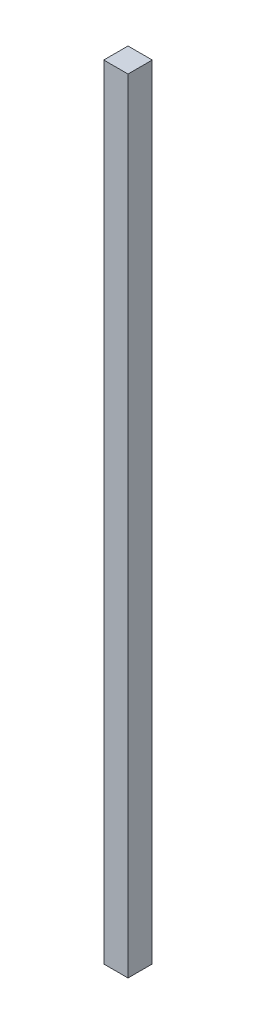
ISO-10303-21;
HEADER;
FILE_DESCRIPTION(('STEP AP214'),'2;1');
FILE_NAME('part.step','',(''),(''),'','','');
FILE_SCHEMA(('AUTOMOTIVE_DESIGN { 1 0 10303 214 1 1 1 1 }'));
ENDSEC;
DATA;
#1=APPLICATION_CONTEXT('core data for automotive mechanical design processes');
#2=APPLICATION_PROTOCOL_DEFINITION('international standard','automotive_design',2000,#1);
#3=PRODUCT_CONTEXT('',#1,'mechanical');
#4=PRODUCT('Part','Part','',(#3));
#5=PRODUCT_RELATED_PRODUCT_CATEGORY('part','',(#4));
#6=PRODUCT_DEFINITION_FORMATION('','',#4);
#7=PRODUCT_DEFINITION_CONTEXT('part definition',#1,'design');
#8=PRODUCT_DEFINITION('design','',#6,#7);
#9=PRODUCT_DEFINITION_SHAPE('','',#8);
#10=(LENGTH_UNIT() NAMED_UNIT(*) SI_UNIT(.MILLI.,.METRE.));
#11=(NAMED_UNIT(*) PLANE_ANGLE_UNIT() SI_UNIT($,.RADIAN.));
#12=(NAMED_UNIT(*) SI_UNIT($,.STERADIAN.) SOLID_ANGLE_UNIT());
#13=UNCERTAINTY_MEASURE_WITH_UNIT(LENGTH_MEASURE(1.E-05),#10,'distance_accuracy_value','');
#14=(GEOMETRIC_REPRESENTATION_CONTEXT(3) GLOBAL_UNCERTAINTY_ASSIGNED_CONTEXT((#13)) GLOBAL_UNIT_ASSIGNED_CONTEXT((#10,
#11,#12)) REPRESENTATION_CONTEXT('',''));
#15=CARTESIAN_POINT('',(0.,0.,0.));
#16=DIRECTION('',(0.,0.,1.));
#17=DIRECTION('',(1.,0.,0.));
#18=AXIS2_PLACEMENT_3D('',#15,#16,#17);
#19=CARTESIAN_POINT('',(44.4500000000009,-1435.10000000001,1173.48));
#20=DIRECTION('',(-1.,0.,0.));
#21=DIRECTION('',(0.,0.,1.));
#22=AXIS2_PLACEMENT_3D('',#19,#20,#21);
#23=PLANE('',#22);
#24=DIRECTION('',(0.,1.,0.));
#25=VECTOR('',#24,1.);
#26=CARTESIAN_POINT('',(44.4500000000009,-1435.10000000001,1084.58));
#27=LINE('',#26,#25);
#28=CARTESIAN_POINT('',(44.4500000000009,-1435.10000000001,1084.58));
#29=VERTEX_POINT('',#28);
#30=CARTESIAN_POINT('',(44.4500000000009,1435.09999999999,1084.58));
#31=VERTEX_POINT('',#30);
#32=EDGE_CURVE('E107',#29,#31,#27,.T.);
#33=ORIENTED_EDGE('',*,*,#32,.T.);
#34=DIRECTION('',(0.,0.,-1.));
#35=VECTOR('',#34,1.);
#36=CARTESIAN_POINT('',(44.4500000000009,1435.09999999999,1173.48));
#37=LINE('',#36,#35);
#38=CARTESIAN_POINT('',(44.4500000000009,1435.09999999999,1173.48));
#39=VERTEX_POINT('',#38);
#40=EDGE_CURVE('E11',#39,#31,#37,.T.);
#41=ORIENTED_EDGE('',*,*,#40,.F.);
#42=DIRECTION('',(0.,1.,0.));
#43=VECTOR('',#42,1.);
#44=CARTESIAN_POINT('',(44.4500000000009,-1435.10000000001,1173.48));
#45=LINE('',#44,#43);
#46=CARTESIAN_POINT('',(44.4500000000009,-1435.10000000001,1173.48));
#47=VERTEX_POINT('',#46);
#48=EDGE_CURVE('E91',#47,#39,#45,.T.);
#49=ORIENTED_EDGE('',*,*,#48,.F.);
#50=DIRECTION('',(0.,0.,-1.));
#51=VECTOR('',#50,1.);
#52=CARTESIAN_POINT('',(44.4500000000009,-1435.10000000001,1173.48));
#53=LINE('',#52,#51);
#54=EDGE_CURVE('E103',#47,#29,#53,.T.);
#55=ORIENTED_EDGE('',*,*,#54,.T.);
#56=EDGE_LOOP('',(#33,#41,#49,#55));
#57=FACE_BOUND('',#56,.T.);
#58=ADVANCED_FACE('F39',(#57),#23,.F.);
#59=CARTESIAN_POINT('',(-44.449999999999,1435.09999999999,1173.48));
#60=DIRECTION('',(0.,-1.,0.));
#61=DIRECTION('',(0.,0.,-1.));
#62=AXIS2_PLACEMENT_3D('',#59,#60,#61);
#63=PLANE('',#62);
#64=DIRECTION('',(-1.,0.,0.));
#65=VECTOR('',#64,1.);
#66=CARTESIAN_POINT('',(-44.449999999999,1435.09999999999,1084.58));
#67=LINE('',#66,#65);
#68=CARTESIAN_POINT('',(-44.449999999999,1435.09999999999,1084.58));
#69=VERTEX_POINT('',#68);
#70=EDGE_CURVE('E96',#31,#69,#67,.T.);
#71=ORIENTED_EDGE('',*,*,#70,.T.);
#72=DIRECTION('',(0.,0.,-1.));
#73=VECTOR('',#72,1.);
#74=CARTESIAN_POINT('',(-44.449999999999,1435.09999999999,1173.48));
#75=LINE('',#74,#73);
#76=CARTESIAN_POINT('',(-44.449999999999,1435.09999999999,1173.48));
#77=VERTEX_POINT('',#76);
#78=EDGE_CURVE('E48',#77,#69,#75,.T.);
#79=ORIENTED_EDGE('',*,*,#78,.F.);
#80=DIRECTION('',(-1.,0.,0.));
#81=VECTOR('',#80,1.);
#82=CARTESIAN_POINT('',(-44.449999999999,1435.09999999999,1173.48));
#83=LINE('',#82,#81);
#84=EDGE_CURVE('E86',#39,#77,#83,.T.);
#85=ORIENTED_EDGE('',*,*,#84,.F.);
#86=ORIENTED_EDGE('',*,*,#40,.T.);
#87=EDGE_LOOP('',(#71,#79,#85,#86));
#88=FACE_BOUND('',#87,.T.);
#89=ADVANCED_FACE('F95',(#88),#63,.F.);
#90=CARTESIAN_POINT('',(-44.449999999999,-1435.10000000001,1173.48));
#91=DIRECTION('',(1.,0.,0.));
#92=DIRECTION('',(0.,0.,-1.));
#93=AXIS2_PLACEMENT_3D('',#90,#91,#92);
#94=PLANE('',#93);
#95=DIRECTION('',(0.,-1.,0.));
#96=VECTOR('',#95,1.);
#97=CARTESIAN_POINT('',(-44.449999999999,-1435.10000000001,1084.58));
#98=LINE('',#97,#96);
#99=CARTESIAN_POINT('',(-44.449999999999,-1435.10000000001,1084.58));
#100=VERTEX_POINT('',#99);
#101=EDGE_CURVE('E73',#69,#100,#98,.T.);
#102=ORIENTED_EDGE('',*,*,#101,.T.);
#103=DIRECTION('',(0.,0.,-1.));
#104=VECTOR('',#103,1.);
#105=CARTESIAN_POINT('',(-44.449999999999,-1435.10000000001,1173.48));
#106=LINE('',#105,#104);
#107=CARTESIAN_POINT('',(-44.449999999999,-1435.10000000001,1173.48));
#108=VERTEX_POINT('',#107);
#109=EDGE_CURVE('E98',#108,#100,#106,.T.);
#110=ORIENTED_EDGE('',*,*,#109,.F.);
#111=DIRECTION('',(0.,-1.,0.));
#112=VECTOR('',#111,1.);
#113=CARTESIAN_POINT('',(-44.449999999999,-1435.10000000001,1173.48));
#114=LINE('',#113,#112);
#115=EDGE_CURVE('E89',#77,#108,#114,.T.);
#116=ORIENTED_EDGE('',*,*,#115,.F.);
#117=ORIENTED_EDGE('',*,*,#78,.T.);
#118=EDGE_LOOP('',(#102,#110,#116,#117));
#119=FACE_BOUND('',#118,.T.);
#120=ADVANCED_FACE('F99',(#119),#94,.F.);
#121=CARTESIAN_POINT('',(-44.449999999999,-1435.10000000001,1173.48));
#122=DIRECTION('',(0.,1.,0.));
#123=DIRECTION('',(0.,0.,1.));
#124=AXIS2_PLACEMENT_3D('',#121,#122,#123);
#125=PLANE('',#124);
#126=DIRECTION('',(1.,0.,0.));
#127=VECTOR('',#126,1.);
#128=CARTESIAN_POINT('',(-44.449999999999,-1435.10000000001,1084.58));
#129=LINE('',#128,#127);
#130=EDGE_CURVE('E79',#100,#29,#129,.T.);
#131=ORIENTED_EDGE('',*,*,#130,.T.);
#132=ORIENTED_EDGE('',*,*,#54,.F.);
#133=DIRECTION('',(1.,0.,0.));
#134=VECTOR('',#133,1.);
#135=CARTESIAN_POINT('',(-44.449999999999,-1435.10000000001,1173.48));
#136=LINE('',#135,#134);
#137=EDGE_CURVE('E56',#108,#47,#136,.T.);
#138=ORIENTED_EDGE('',*,*,#137,.F.);
#139=ORIENTED_EDGE('',*,*,#109,.T.);
#140=EDGE_LOOP('',(#131,#132,#138,#139));
#141=FACE_BOUND('',#140,.T.);
#142=ADVANCED_FACE('F120',(#141),#125,.F.);
#143=CARTESIAN_POINT('',(8.94674169946753E-13,-8.71320096346929E-12,1173.48));
#144=DIRECTION('',(0.,0.,-1.));
#145=DIRECTION('',(-1.,0.,0.));
#146=AXIS2_PLACEMENT_3D('',#143,#144,#145);
#147=PLANE('',#146);
#148=ORIENTED_EDGE('',*,*,#48,.T.);
#149=ORIENTED_EDGE('',*,*,#84,.T.);
#150=ORIENTED_EDGE('',*,*,#115,.T.);
#151=ORIENTED_EDGE('',*,*,#137,.T.);
#152=EDGE_LOOP('',(#148,#149,#150,#151));
#153=FACE_BOUND('',#152,.T.);
#154=ADVANCED_FACE('F87',(#153),#147,.F.);
#155=CARTESIAN_POINT('',(8.94674169946753E-13,-8.71320096346929E-12,1084.58));
#156=DIRECTION('',(0.,0.,-1.));
#157=DIRECTION('',(-1.,0.,0.));
#158=AXIS2_PLACEMENT_3D('',#155,#156,#157);
#159=PLANE('',#158);
#160=ORIENTED_EDGE('',*,*,#32,.F.);
#161=ORIENTED_EDGE('',*,*,#130,.F.);
#162=ORIENTED_EDGE('',*,*,#101,.F.);
#163=ORIENTED_EDGE('',*,*,#70,.F.);
#164=EDGE_LOOP('',(#160,#161,#162,#163));
#165=FACE_BOUND('',#164,.T.);
#166=ADVANCED_FACE('F123',(#165),#159,.T.);
#167=CLOSED_SHELL('',(#58,#89,#120,#142,#154,#166));
#168=MANIFOLD_SOLID_BREP('B2',#167);
#169=ADVANCED_BREP_SHAPE_REPRESENTATION('',(#18,#168),#14);
#170=SHAPE_DEFINITION_REPRESENTATION(#9,#169);
ENDSEC;
END-ISO-10303-21;
